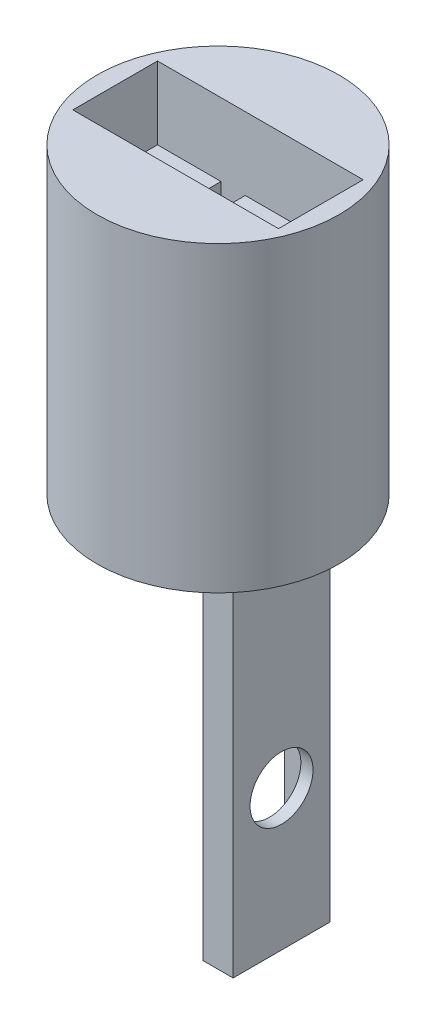
ISO-10303-21;
HEADER;
FILE_DESCRIPTION(('STEP AP214'),'2;1');
FILE_NAME('part.step','',(''),(''),'','','');
FILE_SCHEMA(('AUTOMOTIVE_DESIGN { 1 0 10303 214 1 1 1 1 }'));
ENDSEC;
DATA;
#1=APPLICATION_CONTEXT('core data for automotive mechanical design processes');
#2=APPLICATION_PROTOCOL_DEFINITION('international standard','automotive_design',2000,#1);
#3=PRODUCT_CONTEXT('',#1,'mechanical');
#4=PRODUCT('Part','Part','',(#3));
#5=PRODUCT_RELATED_PRODUCT_CATEGORY('part','',(#4));
#6=PRODUCT_DEFINITION_FORMATION('','',#4);
#7=PRODUCT_DEFINITION_CONTEXT('part definition',#1,'design');
#8=PRODUCT_DEFINITION('design','',#6,#7);
#9=PRODUCT_DEFINITION_SHAPE('','',#8);
#10=(LENGTH_UNIT() NAMED_UNIT(*) SI_UNIT(.MILLI.,.METRE.));
#11=(NAMED_UNIT(*) PLANE_ANGLE_UNIT() SI_UNIT($,.RADIAN.));
#12=(NAMED_UNIT(*) SI_UNIT($,.STERADIAN.) SOLID_ANGLE_UNIT());
#13=UNCERTAINTY_MEASURE_WITH_UNIT(LENGTH_MEASURE(1.E-05),#10,'distance_accuracy_value','');
#14=(GEOMETRIC_REPRESENTATION_CONTEXT(3) GLOBAL_UNCERTAINTY_ASSIGNED_CONTEXT((#13)) GLOBAL_UNIT_ASSIGNED_CONTEXT((#10,
#11,#12)) REPRESENTATION_CONTEXT('',''));
#15=CARTESIAN_POINT('',(0.,0.,0.));
#16=DIRECTION('',(0.,0.,1.));
#17=DIRECTION('',(1.,0.,0.));
#18=AXIS2_PLACEMENT_3D('',#15,#16,#17);
#19=CARTESIAN_POINT('',(0.,19.,0.));
#20=DIRECTION('',(0.,-1.,0.));
#21=DIRECTION('',(0.,0.,-1.));
#22=AXIS2_PLACEMENT_3D('',#19,#20,#21);
#23=PLANE('',#22);
#24=DIRECTION('',(0.,0.,-1.));
#25=VECTOR('',#24,1.);
#26=CARTESIAN_POINT('',(-1.25,19.,-3.5));
#27=LINE('',#26,#25);
#28=CARTESIAN_POINT('',(-1.25,19.,3.5));
#29=VERTEX_POINT('',#28);
#30=CARTESIAN_POINT('',(-1.25,19.,-3.5));
#31=VERTEX_POINT('',#30);
#32=EDGE_CURVE('E163',#29,#31,#27,.T.);
#33=ORIENTED_EDGE('',*,*,#32,.F.);
#34=DIRECTION('',(1.,0.,0.));
#35=VECTOR('',#34,1.);
#36=CARTESIAN_POINT('',(-8.5,19.,3.5));
#37=LINE('',#36,#35);
#38=CARTESIAN_POINT('',(8.5,19.,3.5));
#39=VERTEX_POINT('',#38);
#40=EDGE_CURVE('E206',#29,#39,#37,.T.);
#41=ORIENTED_EDGE('',*,*,#40,.T.);
#42=DIRECTION('',(0.,0.,-1.));
#43=VECTOR('',#42,1.);
#44=CARTESIAN_POINT('',(8.5,19.,3.5));
#45=LINE('',#44,#43);
#46=CARTESIAN_POINT('',(8.5,19.,-3.5));
#47=VERTEX_POINT('',#46);
#48=EDGE_CURVE('E212',#39,#47,#45,.T.);
#49=ORIENTED_EDGE('',*,*,#48,.T.);
#50=DIRECTION('',(-1.,0.,0.));
#51=VECTOR('',#50,1.);
#52=CARTESIAN_POINT('',(-8.5,19.,-3.5));
#53=LINE('',#52,#51);
#54=EDGE_CURVE('E217',#47,#31,#53,.T.);
#55=ORIENTED_EDGE('',*,*,#54,.T.);
#56=EDGE_LOOP('',(#33,#41,#49,#55));
#57=FACE_BOUND('',#56,.T.);
#58=ADVANCED_FACE('F39',(#57),#23,.F.);
#59=DIRECTION('',(0.,0.,1.));
#60=VECTOR('',#59,1.);
#61=CARTESIAN_POINT('',(-3.25,19.,-3.5));
#62=LINE('',#61,#60);
#63=CARTESIAN_POINT('',(-3.25,19.,-3.5));
#64=VERTEX_POINT('',#63);
#65=CARTESIAN_POINT('',(-3.25,19.,3.5));
#66=VERTEX_POINT('',#65);
#67=EDGE_CURVE('E183',#64,#66,#62,.T.);
#68=ORIENTED_EDGE('',*,*,#67,.F.);
#69=CARTESIAN_POINT('',(-8.5,19.,-3.5));
#70=VERTEX_POINT('',#69);
#71=EDGE_CURVE('E216',#64,#70,#53,.T.);
#72=ORIENTED_EDGE('',*,*,#71,.T.);
#73=DIRECTION('',(0.,0.,1.));
#74=VECTOR('',#73,1.);
#75=CARTESIAN_POINT('',(-8.5,19.,3.5));
#76=LINE('',#75,#74);
#77=CARTESIAN_POINT('',(-8.5,19.,3.5));
#78=VERTEX_POINT('',#77);
#79=EDGE_CURVE('E202',#70,#78,#76,.T.);
#80=ORIENTED_EDGE('',*,*,#79,.T.);
#81=EDGE_CURVE('E208',#78,#66,#37,.T.);
#82=ORIENTED_EDGE('',*,*,#81,.T.);
#83=EDGE_LOOP('',(#68,#72,#80,#82));
#84=FACE_BOUND('',#83,.T.);
#85=ADVANCED_FACE('F344',(#84),#23,.F.);
#86=CARTESIAN_POINT('',(0.,0.,0.));
#87=DIRECTION('',(0.,1.,0.));
#88=DIRECTION('',(0.,0.,1.));
#89=AXIS2_PLACEMENT_3D('',#86,#87,#88);
#90=PLANE('',#89);
#91=CARTESIAN_POINT('',(0.,0.,0.));
#92=DIRECTION('',(0.,1.,0.));
#93=DIRECTION('',(0.,0.,1.));
#94=AXIS2_PLACEMENT_3D('',#91,#92,#93);
#95=CIRCLE('',#94,10.);
#96=CARTESIAN_POINT('',(0.,0.,10.));
#97=VERTEX_POINT('',#96);
#98=EDGE_CURVE('E49',#97,#97,#95,.T.);
#99=ORIENTED_EDGE('',*,*,#98,.F.);
#100=EDGE_LOOP('',(#99));
#101=FACE_BOUND('',#100,.T.);
#102=DIRECTION('',(0.,0.,1.));
#103=VECTOR('',#102,1.);
#104=CARTESIAN_POINT('',(5.25,0.,-4.));
#105=LINE('',#104,#103);
#106=CARTESIAN_POINT('',(5.25,0.,-4.));
#107=VERTEX_POINT('',#106);
#108=CARTESIAN_POINT('',(5.25,0.,4.));
#109=VERTEX_POINT('',#108);
#110=EDGE_CURVE('E292',#107,#109,#105,.T.);
#111=ORIENTED_EDGE('',*,*,#110,.F.);
#112=DIRECTION('',(1.,0.,0.));
#113=VECTOR('',#112,1.);
#114=CARTESIAN_POINT('',(2.75,0.,-4.));
#115=LINE('',#114,#113);
#116=CARTESIAN_POINT('',(2.75,0.,-4.));
#117=VERTEX_POINT('',#116);
#118=EDGE_CURVE('E298',#117,#107,#115,.T.);
#119=ORIENTED_EDGE('',*,*,#118,.F.);
#120=DIRECTION('',(0.,0.,-1.));
#121=VECTOR('',#120,1.);
#122=CARTESIAN_POINT('',(2.75,0.,-4.));
#123=LINE('',#122,#121);
#124=CARTESIAN_POINT('',(2.75,0.,4.));
#125=VERTEX_POINT('',#124);
#126=EDGE_CURVE('E315',#125,#117,#123,.T.);
#127=ORIENTED_EDGE('',*,*,#126,.F.);
#128=DIRECTION('',(-1.,0.,0.));
#129=VECTOR('',#128,1.);
#130=CARTESIAN_POINT('',(2.75,0.,4.));
#131=LINE('',#130,#129);
#132=EDGE_CURVE('E311',#109,#125,#131,.T.);
#133=ORIENTED_EDGE('',*,*,#132,.F.);
#134=EDGE_LOOP('',(#111,#119,#127,#133));
#135=FACE_BOUND('',#134,.T.);
#136=ADVANCED_FACE('F341',(#101,#135),#90,.F.);
#137=CARTESIAN_POINT('',(0.,25.,0.));
#138=DIRECTION('',(0.,-1.,0.));
#139=DIRECTION('',(0.,0.,-1.));
#140=AXIS2_PLACEMENT_3D('',#137,#138,#139);
#141=CYLINDRICAL_SURFACE('',#140,10.);
#142=CARTESIAN_POINT('',(0.,25.,0.));
#143=DIRECTION('',(0.,1.,0.));
#144=DIRECTION('',(0.,0.,1.));
#145=AXIS2_PLACEMENT_3D('',#142,#143,#144);
#146=CIRCLE('',#145,10.);
#147=CARTESIAN_POINT('',(0.,25.,10.));
#148=VERTEX_POINT('',#147);
#149=EDGE_CURVE('E11',#148,#148,#146,.T.);
#150=ORIENTED_EDGE('',*,*,#149,.F.);
#151=EDGE_LOOP('',(#150));
#152=FACE_BOUND('',#151,.T.);
#153=ORIENTED_EDGE('',*,*,#98,.T.);
#154=EDGE_LOOP('',(#153));
#155=FACE_BOUND('',#154,.T.);
#156=ADVANCED_FACE('F41',(#152,#155),#141,.T.);
#157=CARTESIAN_POINT('',(0.,25.,0.));
#158=DIRECTION('',(0.,1.,0.));
#159=DIRECTION('',(0.,0.,1.));
#160=AXIS2_PLACEMENT_3D('',#157,#158,#159);
#161=PLANE('',#160);
#162=DIRECTION('',(0.,0.,1.));
#163=VECTOR('',#162,1.);
#164=CARTESIAN_POINT('',(-8.5,25.,3.5));
#165=LINE('',#164,#163);
#166=CARTESIAN_POINT('',(-8.5,25.,-3.5));
#167=VERTEX_POINT('',#166);
#168=CARTESIAN_POINT('',(-8.5,25.,3.5));
#169=VERTEX_POINT('',#168);
#170=EDGE_CURVE('E65',#167,#169,#165,.T.);
#171=ORIENTED_EDGE('',*,*,#170,.F.);
#172=DIRECTION('',(-1.,0.,0.));
#173=VECTOR('',#172,1.);
#174=CARTESIAN_POINT('',(-8.5,25.,-3.5));
#175=LINE('',#174,#173);
#176=CARTESIAN_POINT('',(8.5,25.,-3.5));
#177=VERTEX_POINT('',#176);
#178=EDGE_CURVE('E207',#177,#167,#175,.T.);
#179=ORIENTED_EDGE('',*,*,#178,.F.);
#180=DIRECTION('',(0.,0.,-1.));
#181=VECTOR('',#180,1.);
#182=CARTESIAN_POINT('',(8.5,25.,3.5));
#183=LINE('',#182,#181);
#184=CARTESIAN_POINT('',(8.5,25.,3.5));
#185=VERTEX_POINT('',#184);
#186=EDGE_CURVE('E227',#185,#177,#183,.T.);
#187=ORIENTED_EDGE('',*,*,#186,.F.);
#188=DIRECTION('',(1.,0.,0.));
#189=VECTOR('',#188,1.);
#190=CARTESIAN_POINT('',(-8.5,25.,3.5));
#191=LINE('',#190,#189);
#192=EDGE_CURVE('E223',#169,#185,#191,.T.);
#193=ORIENTED_EDGE('',*,*,#192,.F.);
#194=EDGE_LOOP('',(#171,#179,#187,#193));
#195=FACE_BOUND('',#194,.T.);
#196=ORIENTED_EDGE('',*,*,#149,.T.);
#197=EDGE_LOOP('',(#196));
#198=FACE_BOUND('',#197,.T.);
#199=ADVANCED_FACE('F370',(#195,#198),#161,.T.);
#200=CARTESIAN_POINT('',(5.25,-30.,-4.));
#201=DIRECTION('',(-1.,0.,0.));
#202=DIRECTION('',(0.,0.,1.));
#203=AXIS2_PLACEMENT_3D('',#200,#201,#202);
#204=PLANE('',#203);
#205=CARTESIAN_POINT('',(5.25,-18.4,0.));
#206=DIRECTION('',(1.,0.,0.));
#207=DIRECTION('',(0.,0.,-1.));
#208=AXIS2_PLACEMENT_3D('',#205,#206,#207);
#209=CIRCLE('',#208,2.6);
#210=CARTESIAN_POINT('',(5.25,-18.4,-2.6));
#211=VERTEX_POINT('',#210);
#212=EDGE_CURVE('E288',#211,#211,#209,.T.);
#213=ORIENTED_EDGE('',*,*,#212,.F.);
#214=EDGE_LOOP('',(#213));
#215=FACE_BOUND('',#214,.T.);
#216=ORIENTED_EDGE('',*,*,#110,.T.);
#217=DIRECTION('',(0.,1.,0.));
#218=VECTOR('',#217,1.);
#219=CARTESIAN_POINT('',(5.25,-30.,4.));
#220=LINE('',#219,#218);
#221=CARTESIAN_POINT('',(5.25,-30.,4.));
#222=VERTEX_POINT('',#221);
#223=EDGE_CURVE('E333',#222,#109,#220,.T.);
#224=ORIENTED_EDGE('',*,*,#223,.F.);
#225=DIRECTION('',(0.,0.,1.));
#226=VECTOR('',#225,1.);
#227=CARTESIAN_POINT('',(5.25,-30.,-4.));
#228=LINE('',#227,#226);
#229=CARTESIAN_POINT('',(5.25,-30.,-4.));
#230=VERTEX_POINT('',#229);
#231=EDGE_CURVE('E293',#230,#222,#228,.T.);
#232=ORIENTED_EDGE('',*,*,#231,.F.);
#233=DIRECTION('',(0.,1.,0.));
#234=VECTOR('',#233,1.);
#235=CARTESIAN_POINT('',(5.25,-30.,-4.));
#236=LINE('',#235,#234);
#237=EDGE_CURVE('E307',#230,#107,#236,.T.);
#238=ORIENTED_EDGE('',*,*,#237,.T.);
#239=EDGE_LOOP('',(#216,#224,#232,#238));
#240=FACE_BOUND('',#239,.T.);
#241=ADVANCED_FACE('F353',(#215,#240),#204,.F.);
#242=CARTESIAN_POINT('',(2.75,-30.,4.));
#243=DIRECTION('',(0.,0.,-1.));
#244=DIRECTION('',(-1.,0.,0.));
#245=AXIS2_PLACEMENT_3D('',#242,#243,#244);
#246=PLANE('',#245);
#247=ORIENTED_EDGE('',*,*,#132,.T.);
#248=DIRECTION('',(0.,1.,0.));
#249=VECTOR('',#248,1.);
#250=CARTESIAN_POINT('',(2.75,-30.,4.));
#251=LINE('',#250,#249);
#252=CARTESIAN_POINT('',(2.75,-30.,4.));
#253=VERTEX_POINT('',#252);
#254=EDGE_CURVE('E329',#253,#125,#251,.T.);
#255=ORIENTED_EDGE('',*,*,#254,.F.);
#256=DIRECTION('',(-1.,0.,0.));
#257=VECTOR('',#256,1.);
#258=CARTESIAN_POINT('',(2.75,-30.,4.));
#259=LINE('',#258,#257);
#260=EDGE_CURVE('E297',#222,#253,#259,.T.);
#261=ORIENTED_EDGE('',*,*,#260,.F.);
#262=ORIENTED_EDGE('',*,*,#223,.T.);
#263=EDGE_LOOP('',(#247,#255,#261,#262));
#264=FACE_BOUND('',#263,.T.);
#265=ADVANCED_FACE('F361',(#264),#246,.F.);
#266=CARTESIAN_POINT('',(2.75,-30.,-4.));
#267=DIRECTION('',(1.,0.,0.));
#268=DIRECTION('',(0.,0.,-1.));
#269=AXIS2_PLACEMENT_3D('',#266,#267,#268);
#270=PLANE('',#269);
#271=DIRECTION('',(0.,0.,-1.));
#272=VECTOR('',#271,1.);
#273=CARTESIAN_POINT('',(2.75,-7.8,-2.75));
#274=LINE('',#273,#272);
#275=CARTESIAN_POINT('',(2.75,-7.8,2.75));
#276=VERTEX_POINT('',#275);
#277=CARTESIAN_POINT('',(2.75,-7.8,-2.75));
#278=VERTEX_POINT('',#277);
#279=EDGE_CURVE('E265',#276,#278,#274,.T.);
#280=ORIENTED_EDGE('',*,*,#279,.F.);
#281=DIRECTION('',(0.,1.,0.));
#282=VECTOR('',#281,1.);
#283=CARTESIAN_POINT('',(2.75,-29.,2.75));
#284=LINE('',#283,#282);
#285=CARTESIAN_POINT('',(2.75,-29.,2.75));
#286=VERTEX_POINT('',#285);
#287=EDGE_CURVE('E236',#286,#276,#284,.T.);
#288=ORIENTED_EDGE('',*,*,#287,.F.);
#289=DIRECTION('',(0.,0.,1.));
#290=VECTOR('',#289,1.);
#291=CARTESIAN_POINT('',(2.75,-29.,-2.75));
#292=LINE('',#291,#290);
#293=CARTESIAN_POINT('',(2.75,-29.,-2.75));
#294=VERTEX_POINT('',#293);
#295=EDGE_CURVE('E250',#294,#286,#292,.T.);
#296=ORIENTED_EDGE('',*,*,#295,.F.);
#297=DIRECTION('',(0.,-1.,0.));
#298=VECTOR('',#297,1.);
#299=CARTESIAN_POINT('',(2.75,-29.,-2.75));
#300=LINE('',#299,#298);
#301=EDGE_CURVE('E269',#278,#294,#300,.T.);
#302=ORIENTED_EDGE('',*,*,#301,.F.);
#303=EDGE_LOOP('',(#280,#288,#296,#302));
#304=FACE_BOUND('',#303,.T.);
#305=ORIENTED_EDGE('',*,*,#126,.T.);
#306=DIRECTION('',(0.,1.,0.));
#307=VECTOR('',#306,1.);
#308=CARTESIAN_POINT('',(2.75,-30.,-4.));
#309=LINE('',#308,#307);
#310=CARTESIAN_POINT('',(2.75,-30.,-4.));
#311=VERTEX_POINT('',#310);
#312=EDGE_CURVE('E325',#311,#117,#309,.T.);
#313=ORIENTED_EDGE('',*,*,#312,.F.);
#314=DIRECTION('',(0.,0.,-1.));
#315=VECTOR('',#314,1.);
#316=CARTESIAN_POINT('',(2.75,-30.,-4.));
#317=LINE('',#316,#315);
#318=EDGE_CURVE('E301',#253,#311,#317,.T.);
#319=ORIENTED_EDGE('',*,*,#318,.F.);
#320=ORIENTED_EDGE('',*,*,#254,.T.);
#321=EDGE_LOOP('',(#305,#313,#319,#320));
#322=FACE_BOUND('',#321,.T.);
#323=ADVANCED_FACE('F359',(#304,#322),#270,.F.);
#324=CARTESIAN_POINT('',(2.75,-30.,-4.));
#325=DIRECTION('',(0.,0.,1.));
#326=DIRECTION('',(1.,0.,0.));
#327=AXIS2_PLACEMENT_3D('',#324,#325,#326);
#328=PLANE('',#327);
#329=ORIENTED_EDGE('',*,*,#118,.T.);
#330=ORIENTED_EDGE('',*,*,#237,.F.);
#331=DIRECTION('',(1.,0.,0.));
#332=VECTOR('',#331,1.);
#333=CARTESIAN_POINT('',(2.75,-30.,-4.));
#334=LINE('',#333,#332);
#335=EDGE_CURVE('E304',#311,#230,#334,.T.);
#336=ORIENTED_EDGE('',*,*,#335,.F.);
#337=ORIENTED_EDGE('',*,*,#312,.T.);
#338=EDGE_LOOP('',(#329,#330,#336,#337));
#339=FACE_BOUND('',#338,.T.);
#340=ADVANCED_FACE('F349',(#339),#328,.F.);
#341=CARTESIAN_POINT('',(0.,-30.,0.));
#342=DIRECTION('',(0.,1.,0.));
#343=DIRECTION('',(0.,0.,1.));
#344=AXIS2_PLACEMENT_3D('',#341,#342,#343);
#345=PLANE('',#344);
#346=ORIENTED_EDGE('',*,*,#231,.T.);
#347=ORIENTED_EDGE('',*,*,#260,.T.);
#348=ORIENTED_EDGE('',*,*,#318,.T.);
#349=ORIENTED_EDGE('',*,*,#335,.T.);
#350=EDGE_LOOP('',(#346,#347,#348,#349));
#351=FACE_BOUND('',#350,.T.);
#352=ADVANCED_FACE('F355',(#351),#345,.F.);
#353=CARTESIAN_POINT('',(-10.001,-18.4,0.));
#354=DIRECTION('',(1.,0.,0.));
#355=DIRECTION('',(0.,0.,-1.));
#356=AXIS2_PLACEMENT_3D('',#353,#354,#355);
#357=CYLINDRICAL_SURFACE('',#356,2.6);
#358=CARTESIAN_POINT('',(4.25,-18.4,0.));
#359=DIRECTION('',(1.,0.,0.));
#360=DIRECTION('',(0.,0.,-1.));
#361=AXIS2_PLACEMENT_3D('',#358,#359,#360);
#362=CIRCLE('',#361,2.6);
#363=CARTESIAN_POINT('',(4.25,-18.4,-2.6));
#364=VERTEX_POINT('',#363);
#365=EDGE_CURVE('E43',#364,#364,#362,.F.);
#366=ORIENTED_EDGE('',*,*,#365,.T.);
#367=EDGE_LOOP('',(#366));
#368=FACE_BOUND('',#367,.T.);
#369=ORIENTED_EDGE('',*,*,#212,.T.);
#370=EDGE_LOOP('',(#369));
#371=FACE_BOUND('',#370,.T.);
#372=ADVANCED_FACE('F401',(#368,#371),#357,.F.);
#373=CARTESIAN_POINT('',(4.25,0.,0.));
#374=DIRECTION('',(1.,0.,0.));
#375=DIRECTION('',(0.,0.,-1.));
#376=AXIS2_PLACEMENT_3D('',#373,#374,#375);
#377=PLANE('',#376);
#378=DIRECTION('',(0.,1.,0.));
#379=VECTOR('',#378,1.);
#380=CARTESIAN_POINT('',(4.25,-29.,2.75));
#381=LINE('',#380,#379);
#382=CARTESIAN_POINT('',(4.25,-29.,2.75));
#383=VERTEX_POINT('',#382);
#384=CARTESIAN_POINT('',(4.25,-7.8,2.75));
#385=VERTEX_POINT('',#384);
#386=EDGE_CURVE('E245',#383,#385,#381,.T.);
#387=ORIENTED_EDGE('',*,*,#386,.T.);
#388=DIRECTION('',(0.,0.,-1.));
#389=VECTOR('',#388,1.);
#390=CARTESIAN_POINT('',(4.25,-7.8,-2.75));
#391=LINE('',#390,#389);
#392=CARTESIAN_POINT('',(4.25,-7.8,-2.75));
#393=VERTEX_POINT('',#392);
#394=EDGE_CURVE('E249',#385,#393,#391,.T.);
#395=ORIENTED_EDGE('',*,*,#394,.T.);
#396=DIRECTION('',(0.,-1.,0.));
#397=VECTOR('',#396,1.);
#398=CARTESIAN_POINT('',(4.25,-29.,-2.75));
#399=LINE('',#398,#397);
#400=CARTESIAN_POINT('',(4.25,-29.,-2.75));
#401=VERTEX_POINT('',#400);
#402=EDGE_CURVE('E254',#393,#401,#399,.T.);
#403=ORIENTED_EDGE('',*,*,#402,.T.);
#404=DIRECTION('',(0.,0.,1.));
#405=VECTOR('',#404,1.);
#406=CARTESIAN_POINT('',(4.25,-29.,-2.75));
#407=LINE('',#406,#405);
#408=EDGE_CURVE('E258',#401,#383,#407,.T.);
#409=ORIENTED_EDGE('',*,*,#408,.T.);
#410=EDGE_LOOP('',(#387,#395,#403,#409));
#411=FACE_BOUND('',#410,.T.);
#412=ORIENTED_EDGE('',*,*,#365,.F.);
#413=EDGE_LOOP('',(#412));
#414=FACE_BOUND('',#413,.T.);
#415=ADVANCED_FACE('F397',(#411,#414),#377,.F.);
#416=CARTESIAN_POINT('',(4.25,-29.,2.75));
#417=DIRECTION('',(0.,0.,1.));
#418=DIRECTION('',(1.,0.,0.));
#419=AXIS2_PLACEMENT_3D('',#416,#417,#418);
#420=PLANE('',#419);
#421=ORIENTED_EDGE('',*,*,#287,.T.);
#422=DIRECTION('',(-1.,0.,0.));
#423=VECTOR('',#422,1.);
#424=CARTESIAN_POINT('',(4.25,-7.8,2.75));
#425=LINE('',#424,#423);
#426=EDGE_CURVE('E262',#385,#276,#425,.T.);
#427=ORIENTED_EDGE('',*,*,#426,.F.);
#428=ORIENTED_EDGE('',*,*,#386,.F.);
#429=DIRECTION('',(-1.,0.,0.));
#430=VECTOR('',#429,1.);
#431=CARTESIAN_POINT('',(4.25,-29.,2.75));
#432=LINE('',#431,#430);
#433=EDGE_CURVE('E276',#383,#286,#432,.T.);
#434=ORIENTED_EDGE('',*,*,#433,.T.);
#435=EDGE_LOOP('',(#421,#427,#428,#434));
#436=FACE_BOUND('',#435,.T.);
#437=ADVANCED_FACE('F400',(#436),#420,.F.);
#438=CARTESIAN_POINT('',(4.25,-29.,-2.75));
#439=DIRECTION('',(0.,-1.,0.));
#440=DIRECTION('',(0.,0.,-1.));
#441=AXIS2_PLACEMENT_3D('',#438,#439,#440);
#442=PLANE('',#441);
#443=ORIENTED_EDGE('',*,*,#295,.T.);
#444=ORIENTED_EDGE('',*,*,#433,.F.);
#445=ORIENTED_EDGE('',*,*,#408,.F.);
#446=DIRECTION('',(-1.,0.,0.));
#447=VECTOR('',#446,1.);
#448=CARTESIAN_POINT('',(4.25,-29.,-2.75));
#449=LINE('',#448,#447);
#450=EDGE_CURVE('E279',#401,#294,#449,.T.);
#451=ORIENTED_EDGE('',*,*,#450,.T.);
#452=EDGE_LOOP('',(#443,#444,#445,#451));
#453=FACE_BOUND('',#452,.T.);
#454=ADVANCED_FACE('F403',(#453),#442,.F.);
#455=CARTESIAN_POINT('',(4.25,-29.,-2.75));
#456=DIRECTION('',(0.,0.,-1.));
#457=DIRECTION('',(-1.,0.,0.));
#458=AXIS2_PLACEMENT_3D('',#455,#456,#457);
#459=PLANE('',#458);
#460=ORIENTED_EDGE('',*,*,#301,.T.);
#461=ORIENTED_EDGE('',*,*,#450,.F.);
#462=ORIENTED_EDGE('',*,*,#402,.F.);
#463=DIRECTION('',(-1.,0.,0.));
#464=VECTOR('',#463,1.);
#465=CARTESIAN_POINT('',(4.25,-7.8,-2.75));
#466=LINE('',#465,#464);
#467=EDGE_CURVE('E282',#393,#278,#466,.T.);
#468=ORIENTED_EDGE('',*,*,#467,.T.);
#469=EDGE_LOOP('',(#460,#461,#462,#468));
#470=FACE_BOUND('',#469,.T.);
#471=ADVANCED_FACE('F406',(#470),#459,.F.);
#472=CARTESIAN_POINT('',(4.25,-7.8,-2.75));
#473=DIRECTION('',(0.,1.,0.));
#474=DIRECTION('',(0.,0.,1.));
#475=AXIS2_PLACEMENT_3D('',#472,#473,#474);
#476=PLANE('',#475);
#477=ORIENTED_EDGE('',*,*,#279,.T.);
#478=ORIENTED_EDGE('',*,*,#467,.F.);
#479=ORIENTED_EDGE('',*,*,#394,.F.);
#480=ORIENTED_EDGE('',*,*,#426,.T.);
#481=EDGE_LOOP('',(#477,#478,#479,#480));
#482=FACE_BOUND('',#481,.T.);
#483=ADVANCED_FACE('F396',(#482),#476,.F.);
#484=CARTESIAN_POINT('',(-8.5,19.,3.5));
#485=DIRECTION('',(-1.,0.,0.));
#486=DIRECTION('',(0.,0.,1.));
#487=AXIS2_PLACEMENT_3D('',#484,#485,#486);
#488=PLANE('',#487);
#489=ORIENTED_EDGE('',*,*,#170,.T.);
#490=DIRECTION('',(0.,1.,0.));
#491=VECTOR('',#490,1.);
#492=CARTESIAN_POINT('',(-8.5,19.,3.5));
#493=LINE('',#492,#491);
#494=EDGE_CURVE('E220',#78,#169,#493,.T.);
#495=ORIENTED_EDGE('',*,*,#494,.F.);
#496=ORIENTED_EDGE('',*,*,#79,.F.);
#497=DIRECTION('',(0.,1.,0.));
#498=VECTOR('',#497,1.);
#499=CARTESIAN_POINT('',(-8.5,19.,-3.5));
#500=LINE('',#499,#498);
#501=EDGE_CURVE('E233',#70,#167,#500,.T.);
#502=ORIENTED_EDGE('',*,*,#501,.T.);
#503=EDGE_LOOP('',(#489,#495,#496,#502));
#504=FACE_BOUND('',#503,.T.);
#505=ADVANCED_FACE('F386',(#504),#488,.F.);
#506=CARTESIAN_POINT('',(-8.5,19.,-3.5));
#507=DIRECTION('',(0.,0.,-1.));
#508=DIRECTION('',(-1.,0.,0.));
#509=AXIS2_PLACEMENT_3D('',#506,#507,#508);
#510=PLANE('',#509);
#511=ORIENTED_EDGE('',*,*,#178,.T.);
#512=ORIENTED_EDGE('',*,*,#501,.F.);
#513=ORIENTED_EDGE('',*,*,#71,.F.);
#514=DIRECTION('',(0.,1.,0.));
#515=VECTOR('',#514,1.);
#516=CARTESIAN_POINT('',(-3.25,15.,-3.5));
#517=LINE('',#516,#515);
#518=CARTESIAN_POINT('',(-3.25,15.,-3.5));
#519=VERTEX_POINT('',#518);
#520=EDGE_CURVE('E57',#519,#64,#517,.T.);
#521=ORIENTED_EDGE('',*,*,#520,.F.);
#522=DIRECTION('',(-1.,0.,0.));
#523=VECTOR('',#522,1.);
#524=CARTESIAN_POINT('',(-1.25,15.,-3.5));
#525=LINE('',#524,#523);
#526=CARTESIAN_POINT('',(-1.25,15.,-3.5));
#527=VERTEX_POINT('',#526);
#528=EDGE_CURVE('E171',#527,#519,#525,.T.);
#529=ORIENTED_EDGE('',*,*,#528,.F.);
#530=DIRECTION('',(0.,1.,0.));
#531=VECTOR('',#530,1.);
#532=CARTESIAN_POINT('',(-1.25,15.,-3.5));
#533=LINE('',#532,#531);
#534=EDGE_CURVE('E156',#527,#31,#533,.T.);
#535=ORIENTED_EDGE('',*,*,#534,.T.);
#536=ORIENTED_EDGE('',*,*,#54,.F.);
#537=DIRECTION('',(0.,1.,0.));
#538=VECTOR('',#537,1.);
#539=CARTESIAN_POINT('',(8.5,19.,-3.5));
#540=LINE('',#539,#538);
#541=EDGE_CURVE('E237',#47,#177,#540,.T.);
#542=ORIENTED_EDGE('',*,*,#541,.T.);
#543=EDGE_LOOP('',(#511,#512,#513,#521,#529,#535,#536,#542));
#544=FACE_BOUND('',#543,.T.);
#545=ADVANCED_FACE('F173',(#544),#510,.F.);
#546=CARTESIAN_POINT('',(8.5,19.,3.5));
#547=DIRECTION('',(1.,0.,0.));
#548=DIRECTION('',(0.,0.,-1.));
#549=AXIS2_PLACEMENT_3D('',#546,#547,#548);
#550=PLANE('',#549);
#551=ORIENTED_EDGE('',*,*,#186,.T.);
#552=ORIENTED_EDGE('',*,*,#541,.F.);
#553=ORIENTED_EDGE('',*,*,#48,.F.);
#554=DIRECTION('',(0.,1.,0.));
#555=VECTOR('',#554,1.);
#556=CARTESIAN_POINT('',(8.5,19.,3.5));
#557=LINE('',#556,#555);
#558=EDGE_CURVE('E240',#39,#185,#557,.T.);
#559=ORIENTED_EDGE('',*,*,#558,.T.);
#560=EDGE_LOOP('',(#551,#552,#553,#559));
#561=FACE_BOUND('',#560,.T.);
#562=ADVANCED_FACE('F385',(#561),#550,.F.);
#563=CARTESIAN_POINT('',(-8.5,19.,3.5));
#564=DIRECTION('',(0.,0.,1.));
#565=DIRECTION('',(1.,0.,0.));
#566=AXIS2_PLACEMENT_3D('',#563,#564,#565);
#567=PLANE('',#566);
#568=ORIENTED_EDGE('',*,*,#192,.T.);
#569=ORIENTED_EDGE('',*,*,#558,.F.);
#570=ORIENTED_EDGE('',*,*,#40,.F.);
#571=DIRECTION('',(0.,1.,0.));
#572=VECTOR('',#571,1.);
#573=CARTESIAN_POINT('',(-1.25,15.,3.5));
#574=LINE('',#573,#572);
#575=CARTESIAN_POINT('',(-1.25,15.,3.5));
#576=VERTEX_POINT('',#575);
#577=EDGE_CURVE('E194',#576,#29,#574,.T.);
#578=ORIENTED_EDGE('',*,*,#577,.F.);
#579=DIRECTION('',(1.,0.,0.));
#580=VECTOR('',#579,1.);
#581=CARTESIAN_POINT('',(-1.25,15.,3.5));
#582=LINE('',#581,#580);
#583=CARTESIAN_POINT('',(-3.25,15.,3.5));
#584=VERTEX_POINT('',#583);
#585=EDGE_CURVE('E168',#584,#576,#582,.T.);
#586=ORIENTED_EDGE('',*,*,#585,.F.);
#587=DIRECTION('',(0.,1.,0.));
#588=VECTOR('',#587,1.);
#589=CARTESIAN_POINT('',(-3.25,15.,3.5));
#590=LINE('',#589,#588);
#591=EDGE_CURVE('E197',#584,#66,#590,.T.);
#592=ORIENTED_EDGE('',*,*,#591,.T.);
#593=ORIENTED_EDGE('',*,*,#81,.F.);
#594=ORIENTED_EDGE('',*,*,#494,.T.);
#595=EDGE_LOOP('',(#568,#569,#570,#578,#586,#592,#593,#594));
#596=FACE_BOUND('',#595,.T.);
#597=ADVANCED_FACE('F389',(#596),#567,.F.);
#598=CARTESIAN_POINT('',(-1.25,15.,-3.5));
#599=DIRECTION('',(1.,0.,0.));
#600=DIRECTION('',(0.,0.,-1.));
#601=AXIS2_PLACEMENT_3D('',#598,#599,#600);
#602=PLANE('',#601);
#603=ORIENTED_EDGE('',*,*,#32,.T.);
#604=ORIENTED_EDGE('',*,*,#534,.F.);
#605=DIRECTION('',(0.,0.,-1.));
#606=VECTOR('',#605,1.);
#607=CARTESIAN_POINT('',(-1.25,15.,-3.5));
#608=LINE('',#607,#606);
#609=EDGE_CURVE('E160',#576,#527,#608,.T.);
#610=ORIENTED_EDGE('',*,*,#609,.F.);
#611=ORIENTED_EDGE('',*,*,#577,.T.);
#612=EDGE_LOOP('',(#603,#604,#610,#611));
#613=FACE_BOUND('',#612,.T.);
#614=ADVANCED_FACE('F158',(#613),#602,.F.);
#615=CARTESIAN_POINT('',(-3.25,15.,-3.5));
#616=DIRECTION('',(-1.,0.,0.));
#617=DIRECTION('',(0.,0.,1.));
#618=AXIS2_PLACEMENT_3D('',#615,#616,#617);
#619=PLANE('',#618);
#620=ORIENTED_EDGE('',*,*,#67,.T.);
#621=ORIENTED_EDGE('',*,*,#591,.F.);
#622=DIRECTION('',(0.,0.,1.));
#623=VECTOR('',#622,1.);
#624=CARTESIAN_POINT('',(-3.25,15.,-3.5));
#625=LINE('',#624,#623);
#626=EDGE_CURVE('E178',#519,#584,#625,.T.);
#627=ORIENTED_EDGE('',*,*,#626,.F.);
#628=ORIENTED_EDGE('',*,*,#520,.T.);
#629=EDGE_LOOP('',(#620,#621,#627,#628));
#630=FACE_BOUND('',#629,.T.);
#631=ADVANCED_FACE('F480',(#630),#619,.F.);
#632=CARTESIAN_POINT('',(0.,15.,0.));
#633=DIRECTION('',(0.,-1.,0.));
#634=DIRECTION('',(0.,0.,-1.));
#635=AXIS2_PLACEMENT_3D('',#632,#633,#634);
#636=PLANE('',#635);
#637=ORIENTED_EDGE('',*,*,#609,.T.);
#638=ORIENTED_EDGE('',*,*,#528,.T.);
#639=ORIENTED_EDGE('',*,*,#626,.T.);
#640=ORIENTED_EDGE('',*,*,#585,.T.);
#641=EDGE_LOOP('',(#637,#638,#639,#640));
#642=FACE_BOUND('',#641,.T.);
#643=ADVANCED_FACE('F180',(#642),#636,.F.);
#644=CLOSED_SHELL('',(#58,#85,#136,#156,#199,#241,#265,#323,#340,#352,#372,#415,#437,#454,#471,
#483,#505,#545,#562,#597,#614,#631,#643));
#645=MANIFOLD_SOLID_BREP('B2',#644);
#646=ADVANCED_BREP_SHAPE_REPRESENTATION('',(#18,#645),#14);
#647=SHAPE_DEFINITION_REPRESENTATION(#9,#646);
ENDSEC;
END-ISO-10303-21;
